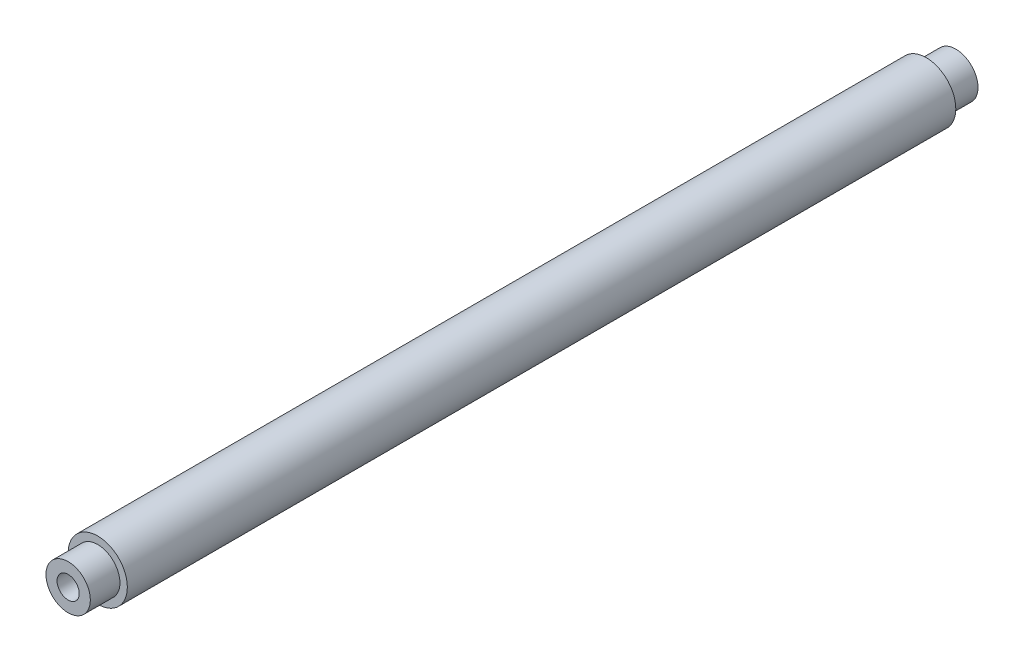
ISO-10303-21;
HEADER;
FILE_DESCRIPTION(('STEP AP214'),'2;1');
FILE_NAME('part.step','',(''),(''),'','','');
FILE_SCHEMA(('AUTOMOTIVE_DESIGN { 1 0 10303 214 1 1 1 1 }'));
ENDSEC;
DATA;
#1=APPLICATION_CONTEXT('core data for automotive mechanical design processes');
#2=APPLICATION_PROTOCOL_DEFINITION('international standard','automotive_design',2000,#1);
#3=PRODUCT_CONTEXT('',#1,'mechanical');
#4=PRODUCT('Part','Part','',(#3));
#5=PRODUCT_RELATED_PRODUCT_CATEGORY('part','',(#4));
#6=PRODUCT_DEFINITION_FORMATION('','',#4);
#7=PRODUCT_DEFINITION_CONTEXT('part definition',#1,'design');
#8=PRODUCT_DEFINITION('design','',#6,#7);
#9=PRODUCT_DEFINITION_SHAPE('','',#8);
#10=(LENGTH_UNIT() NAMED_UNIT(*) SI_UNIT(.MILLI.,.METRE.));
#11=(NAMED_UNIT(*) PLANE_ANGLE_UNIT() SI_UNIT($,.RADIAN.));
#12=(NAMED_UNIT(*) SI_UNIT($,.STERADIAN.) SOLID_ANGLE_UNIT());
#13=UNCERTAINTY_MEASURE_WITH_UNIT(LENGTH_MEASURE(1.E-05),#10,'distance_accuracy_value','');
#14=(GEOMETRIC_REPRESENTATION_CONTEXT(3) GLOBAL_UNCERTAINTY_ASSIGNED_CONTEXT((#13)) GLOBAL_UNIT_ASSIGNED_CONTEXT((#10,
#11,#12)) REPRESENTATION_CONTEXT('',''));
#15=CARTESIAN_POINT('',(0.,0.,0.));
#16=DIRECTION('',(0.,0.,1.));
#17=DIRECTION('',(1.,0.,0.));
#18=AXIS2_PLACEMENT_3D('',#15,#16,#17);
#19=CARTESIAN_POINT('',(0.,0.,120.));
#20=DIRECTION('',(0.,0.,-1.));
#21=DIRECTION('',(-1.,0.,0.));
#22=AXIS2_PLACEMENT_3D('',#19,#20,#21);
#23=CYLINDRICAL_SURFACE('',#22,4.);
#24=CARTESIAN_POINT('',(0.,0.,4.));
#25=DIRECTION('',(0.,0.,1.));
#26=DIRECTION('',(1.,0.,0.));
#27=AXIS2_PLACEMENT_3D('',#24,#25,#26);
#28=CIRCLE('',#27,4.);
#29=CARTESIAN_POINT('',(4.,0.,4.));
#30=VERTEX_POINT('',#29);
#31=EDGE_CURVE('E11',#30,#30,#28,.T.);
#32=ORIENTED_EDGE('',*,*,#31,.T.);
#33=EDGE_LOOP('',(#32));
#34=FACE_BOUND('',#33,.T.);
#35=CARTESIAN_POINT('',(0.,0.,116.));
#36=DIRECTION('',(0.,0.,1.));
#37=DIRECTION('',(1.,0.,0.));
#38=AXIS2_PLACEMENT_3D('',#35,#36,#37);
#39=CIRCLE('',#38,4.);
#40=CARTESIAN_POINT('',(4.,0.,116.));
#41=VERTEX_POINT('',#40);
#42=EDGE_CURVE('E78',#41,#41,#39,.T.);
#43=ORIENTED_EDGE('',*,*,#42,.F.);
#44=EDGE_LOOP('',(#43));
#45=FACE_BOUND('',#44,.T.);
#46=ADVANCED_FACE('F30',(#34,#45),#23,.T.);
#47=CARTESIAN_POINT('',(0.,0.,4.));
#48=DIRECTION('',(0.,0.,1.));
#49=DIRECTION('',(1.,0.,0.));
#50=AXIS2_PLACEMENT_3D('',#47,#48,#49);
#51=PLANE('',#50);
#52=ORIENTED_EDGE('',*,*,#31,.F.);
#53=EDGE_LOOP('',(#52));
#54=FACE_BOUND('',#53,.T.);
#55=CARTESIAN_POINT('',(0.,0.,4.));
#56=DIRECTION('',(0.,0.,1.));
#57=DIRECTION('',(1.,0.,0.));
#58=AXIS2_PLACEMENT_3D('',#55,#56,#57);
#59=CIRCLE('',#58,3.);
#60=CARTESIAN_POINT('',(3.,0.,4.));
#61=VERTEX_POINT('',#60);
#62=EDGE_CURVE('E37',#61,#61,#59,.T.);
#63=ORIENTED_EDGE('',*,*,#62,.T.);
#64=EDGE_LOOP('',(#63));
#65=FACE_BOUND('',#64,.T.);
#66=ADVANCED_FACE('F86',(#54,#65),#51,.F.);
#67=CARTESIAN_POINT('',(0.,0.,4.));
#68=DIRECTION('',(0.,0.,-1.));
#69=DIRECTION('',(-1.,0.,0.));
#70=AXIS2_PLACEMENT_3D('',#67,#68,#69);
#71=CYLINDRICAL_SURFACE('',#70,3.);
#72=ORIENTED_EDGE('',*,*,#62,.F.);
#73=EDGE_LOOP('',(#72));
#74=FACE_BOUND('',#73,.T.);
#75=CARTESIAN_POINT('',(0.,0.,0.));
#76=DIRECTION('',(0.,0.,1.));
#77=DIRECTION('',(1.,0.,0.));
#78=AXIS2_PLACEMENT_3D('',#75,#76,#77);
#79=CIRCLE('',#78,3.);
#80=CARTESIAN_POINT('',(3.,0.,0.));
#81=VERTEX_POINT('',#80);
#82=EDGE_CURVE('E81',#81,#81,#79,.T.);
#83=ORIENTED_EDGE('',*,*,#82,.T.);
#84=EDGE_LOOP('',(#83));
#85=FACE_BOUND('',#84,.T.);
#86=ADVANCED_FACE('F88',(#74,#85),#71,.T.);
#87=CARTESIAN_POINT('',(0.,0.,0.));
#88=DIRECTION('',(0.,0.,1.));
#89=DIRECTION('',(1.,0.,0.));
#90=AXIS2_PLACEMENT_3D('',#87,#88,#89);
#91=PLANE('',#90);
#92=CARTESIAN_POINT('',(0.,0.,0.));
#93=DIRECTION('',(0.,0.,-1.));
#94=DIRECTION('',(-1.,0.,0.));
#95=AXIS2_PLACEMENT_3D('',#92,#93,#94);
#96=CIRCLE('',#95,1.5);
#97=CARTESIAN_POINT('',(-1.5,0.,0.));
#98=VERTEX_POINT('',#97);
#99=EDGE_CURVE('E153',#98,#98,#96,.T.);
#100=ORIENTED_EDGE('',*,*,#99,.F.);
#101=EDGE_LOOP('',(#100));
#102=FACE_BOUND('',#101,.T.);
#103=ORIENTED_EDGE('',*,*,#82,.F.);
#104=EDGE_LOOP('',(#103));
#105=FACE_BOUND('',#104,.T.);
#106=ADVANCED_FACE('F91',(#102,#105),#91,.F.);
#107=CARTESIAN_POINT('',(0.,0.,116.));
#108=DIRECTION('',(0.,0.,1.));
#109=DIRECTION('',(1.,0.,0.));
#110=AXIS2_PLACEMENT_3D('',#107,#108,#109);
#111=PLANE('',#110);
#112=CARTESIAN_POINT('',(0.,0.,116.));
#113=DIRECTION('',(0.,0.,1.));
#114=DIRECTION('',(1.,0.,0.));
#115=AXIS2_PLACEMENT_3D('',#112,#113,#114);
#116=CIRCLE('',#115,3.);
#117=CARTESIAN_POINT('',(3.,0.,116.));
#118=VERTEX_POINT('',#117);
#119=EDGE_CURVE('E75',#118,#118,#116,.T.);
#120=ORIENTED_EDGE('',*,*,#119,.F.);
#121=EDGE_LOOP('',(#120));
#122=FACE_BOUND('',#121,.T.);
#123=ORIENTED_EDGE('',*,*,#42,.T.);
#124=EDGE_LOOP('',(#123));
#125=FACE_BOUND('',#124,.T.);
#126=ADVANCED_FACE('F96',(#122,#125),#111,.T.);
#127=CARTESIAN_POINT('',(0.,0.,116.));
#128=DIRECTION('',(0.,0.,1.));
#129=DIRECTION('',(1.,0.,0.));
#130=AXIS2_PLACEMENT_3D('',#127,#128,#129);
#131=CYLINDRICAL_SURFACE('',#130,3.);
#132=ORIENTED_EDGE('',*,*,#119,.T.);
#133=EDGE_LOOP('',(#132));
#134=FACE_BOUND('',#133,.T.);
#135=CARTESIAN_POINT('',(0.,0.,120.));
#136=DIRECTION('',(0.,0.,1.));
#137=DIRECTION('',(1.,0.,0.));
#138=AXIS2_PLACEMENT_3D('',#135,#136,#137);
#139=CIRCLE('',#138,3.);
#140=CARTESIAN_POINT('',(3.,0.,120.));
#141=VERTEX_POINT('',#140);
#142=EDGE_CURVE('E72',#141,#141,#139,.T.);
#143=ORIENTED_EDGE('',*,*,#142,.F.);
#144=EDGE_LOOP('',(#143));
#145=FACE_BOUND('',#144,.T.);
#146=ADVANCED_FACE('F102',(#134,#145),#131,.T.);
#147=CARTESIAN_POINT('',(0.,0.,120.));
#148=DIRECTION('',(0.,0.,1.));
#149=DIRECTION('',(1.,0.,0.));
#150=AXIS2_PLACEMENT_3D('',#147,#148,#149);
#151=PLANE('',#150);
#152=CARTESIAN_POINT('',(0.,0.,120.));
#153=DIRECTION('',(0.,0.,1.));
#154=DIRECTION('',(1.,0.,0.));
#155=AXIS2_PLACEMENT_3D('',#152,#153,#154);
#156=CIRCLE('',#155,1.5);
#157=CARTESIAN_POINT('',(1.5,0.,120.));
#158=VERTEX_POINT('',#157);
#159=EDGE_CURVE('E53',#158,#158,#156,.T.);
#160=ORIENTED_EDGE('',*,*,#159,.F.);
#161=EDGE_LOOP('',(#160));
#162=FACE_BOUND('',#161,.T.);
#163=ORIENTED_EDGE('',*,*,#142,.T.);
#164=EDGE_LOOP('',(#163));
#165=FACE_BOUND('',#164,.T.);
#166=ADVANCED_FACE('F122',(#162,#165),#151,.T.);
#167=CARTESIAN_POINT('',(0.,0.,109.));
#168=DIRECTION('',(0.,0.,1.));
#169=DIRECTION('',(1.,0.,0.));
#170=AXIS2_PLACEMENT_3D('',#167,#168,#169);
#171=CONICAL_SURFACE('',#170,1.25,1.02974425867666);
#172=CARTESIAN_POINT('',(0.,0.,108.248924226216));
#173=VERTEX_POINT('',#172);
#174=VERTEX_LOOP('',#173);
#175=FACE_BOUND('',#174,.T.);
#176=CARTESIAN_POINT('',(0.,0.,109.));
#177=DIRECTION('',(0.,0.,1.));
#178=DIRECTION('',(1.,0.,0.));
#179=AXIS2_PLACEMENT_3D('',#176,#177,#178);
#180=CIRCLE('',#179,1.25);
#181=CARTESIAN_POINT('',(1.25,0.,109.));
#182=VERTEX_POINT('',#181);
#183=EDGE_CURVE('E69',#182,#182,#180,.T.);
#184=ORIENTED_EDGE('',*,*,#183,.T.);
#185=EDGE_LOOP('',(#184));
#186=FACE_BOUND('',#185,.T.);
#187=ADVANCED_FACE('F124',(#175,#186),#171,.F.);
#188=CARTESIAN_POINT('',(0.,0.,120.));
#189=DIRECTION('',(0.,0.,1.));
#190=DIRECTION('',(1.,0.,0.));
#191=AXIS2_PLACEMENT_3D('',#188,#189,#190);
#192=CYLINDRICAL_SURFACE('',#191,1.25);
#193=ORIENTED_EDGE('',*,*,#183,.F.);
#194=EDGE_LOOP('',(#193));
#195=FACE_BOUND('',#194,.T.);
#196=CARTESIAN_POINT('',(0.,0.,112.));
#197=DIRECTION('',(0.,0.,1.));
#198=DIRECTION('',(1.,0.,0.));
#199=AXIS2_PLACEMENT_3D('',#196,#197,#198);
#200=CIRCLE('',#199,1.25);
#201=CARTESIAN_POINT('',(1.25,0.,112.));
#202=VERTEX_POINT('',#201);
#203=EDGE_CURVE('E66',#202,#202,#200,.T.);
#204=ORIENTED_EDGE('',*,*,#203,.T.);
#205=EDGE_LOOP('',(#204));
#206=FACE_BOUND('',#205,.T.);
#207=ADVANCED_FACE('F127',(#195,#206),#192,.F.);
#208=CARTESIAN_POINT('',(1.25,0.,112.));
#209=DIRECTION('',(0.,0.,-1.));
#210=DIRECTION('',(-1.,0.,0.));
#211=AXIS2_PLACEMENT_3D('',#208,#209,#210);
#212=PLANE('',#211);
#213=ORIENTED_EDGE('',*,*,#203,.F.);
#214=EDGE_LOOP('',(#213));
#215=FACE_BOUND('',#214,.T.);
#216=CARTESIAN_POINT('',(0.,0.,112.));
#217=DIRECTION('',(0.,0.,1.));
#218=DIRECTION('',(1.,0.,0.));
#219=AXIS2_PLACEMENT_3D('',#216,#217,#218);
#220=CIRCLE('',#219,1.5);
#221=CARTESIAN_POINT('',(1.5,0.,112.));
#222=VERTEX_POINT('',#221);
#223=EDGE_CURVE('E57',#222,#222,#220,.T.);
#224=ORIENTED_EDGE('',*,*,#223,.T.);
#225=EDGE_LOOP('',(#224));
#226=FACE_BOUND('',#225,.T.);
#227=ADVANCED_FACE('F130',(#215,#226),#212,.F.);
#228=CARTESIAN_POINT('',(0.,0.,120.));
#229=DIRECTION('',(0.,0.,1.));
#230=DIRECTION('',(1.,0.,0.));
#231=AXIS2_PLACEMENT_3D('',#228,#229,#230);
#232=CYLINDRICAL_SURFACE('',#231,1.5);
#233=ORIENTED_EDGE('',*,*,#223,.F.);
#234=EDGE_LOOP('',(#233));
#235=FACE_BOUND('',#234,.T.);
#236=ORIENTED_EDGE('',*,*,#159,.T.);
#237=EDGE_LOOP('',(#236));
#238=FACE_BOUND('',#237,.T.);
#239=ADVANCED_FACE('F47',(#235,#238),#232,.F.);
#240=CARTESIAN_POINT('',(0.,0.,11.));
#241=DIRECTION('',(0.,0.,-1.));
#242=DIRECTION('',(-1.,0.,0.));
#243=AXIS2_PLACEMENT_3D('',#240,#241,#242);
#244=CONICAL_SURFACE('',#243,1.25,1.02974425867666);
#245=CARTESIAN_POINT('',(0.,0.,11.7510757737844));
#246=VERTEX_POINT('',#245);
#247=VERTEX_LOOP('',#246);
#248=FACE_BOUND('',#247,.T.);
#249=CARTESIAN_POINT('',(0.,0.,11.));
#250=DIRECTION('',(0.,0.,-1.));
#251=DIRECTION('',(-1.,0.,0.));
#252=AXIS2_PLACEMENT_3D('',#249,#250,#251);
#253=CIRCLE('',#252,1.25);
#254=CARTESIAN_POINT('',(-1.25,0.,11.));
#255=VERTEX_POINT('',#254);
#256=EDGE_CURVE('E51',#255,#255,#253,.T.);
#257=ORIENTED_EDGE('',*,*,#256,.T.);
#258=EDGE_LOOP('',(#257));
#259=FACE_BOUND('',#258,.T.);
#260=ADVANCED_FACE('F43',(#248,#259),#244,.F.);
#261=CARTESIAN_POINT('',(0.,0.,0.));
#262=DIRECTION('',(0.,0.,-1.));
#263=DIRECTION('',(-1.,0.,0.));
#264=AXIS2_PLACEMENT_3D('',#261,#262,#263);
#265=CYLINDRICAL_SURFACE('',#264,1.25);
#266=ORIENTED_EDGE('',*,*,#256,.F.);
#267=EDGE_LOOP('',(#266));
#268=FACE_BOUND('',#267,.T.);
#269=CARTESIAN_POINT('',(0.,0.,8.));
#270=DIRECTION('',(0.,0.,-1.));
#271=DIRECTION('',(-1.,0.,0.));
#272=AXIS2_PLACEMENT_3D('',#269,#270,#271);
#273=CIRCLE('',#272,1.25);
#274=CARTESIAN_POINT('',(-1.25,0.,8.));
#275=VERTEX_POINT('',#274);
#276=EDGE_CURVE('E54',#275,#275,#273,.T.);
#277=ORIENTED_EDGE('',*,*,#276,.T.);
#278=EDGE_LOOP('',(#277));
#279=FACE_BOUND('',#278,.T.);
#280=ADVANCED_FACE('F46',(#268,#279),#265,.F.);
#281=CARTESIAN_POINT('',(1.25,0.,8.));
#282=DIRECTION('',(0.,0.,1.));
#283=DIRECTION('',(1.,0.,0.));
#284=AXIS2_PLACEMENT_3D('',#281,#282,#283);
#285=PLANE('',#284);
#286=ORIENTED_EDGE('',*,*,#276,.F.);
#287=EDGE_LOOP('',(#286));
#288=FACE_BOUND('',#287,.T.);
#289=CARTESIAN_POINT('',(0.,0.,8.));
#290=DIRECTION('',(0.,0.,-1.));
#291=DIRECTION('',(-1.,0.,0.));
#292=AXIS2_PLACEMENT_3D('',#289,#290,#291);
#293=CIRCLE('',#292,1.5);
#294=CARTESIAN_POINT('',(-1.5,0.,8.));
#295=VERTEX_POINT('',#294);
#296=EDGE_CURVE('E60',#295,#295,#293,.T.);
#297=ORIENTED_EDGE('',*,*,#296,.T.);
#298=EDGE_LOOP('',(#297));
#299=FACE_BOUND('',#298,.T.);
#300=ADVANCED_FACE('F140',(#288,#299),#285,.F.);
#301=CARTESIAN_POINT('',(0.,0.,0.));
#302=DIRECTION('',(0.,0.,-1.));
#303=DIRECTION('',(-1.,0.,0.));
#304=AXIS2_PLACEMENT_3D('',#301,#302,#303);
#305=CYLINDRICAL_SURFACE('',#304,1.5);
#306=ORIENTED_EDGE('',*,*,#296,.F.);
#307=EDGE_LOOP('',(#306));
#308=FACE_BOUND('',#307,.T.);
#309=ORIENTED_EDGE('',*,*,#99,.T.);
#310=EDGE_LOOP('',(#309));
#311=FACE_BOUND('',#310,.T.);
#312=ADVANCED_FACE('F143',(#308,#311),#305,.F.);
#313=CLOSED_SHELL('',(#46,#66,#86,#106,#126,#146,#166,#187,#207,#227,#239,#260,#280,#300,#312));
#314=MANIFOLD_SOLID_BREP('B2',#313);
#315=ADVANCED_BREP_SHAPE_REPRESENTATION('',(#18,#314),#14);
#316=SHAPE_DEFINITION_REPRESENTATION(#9,#315);
ENDSEC;
END-ISO-10303-21;
